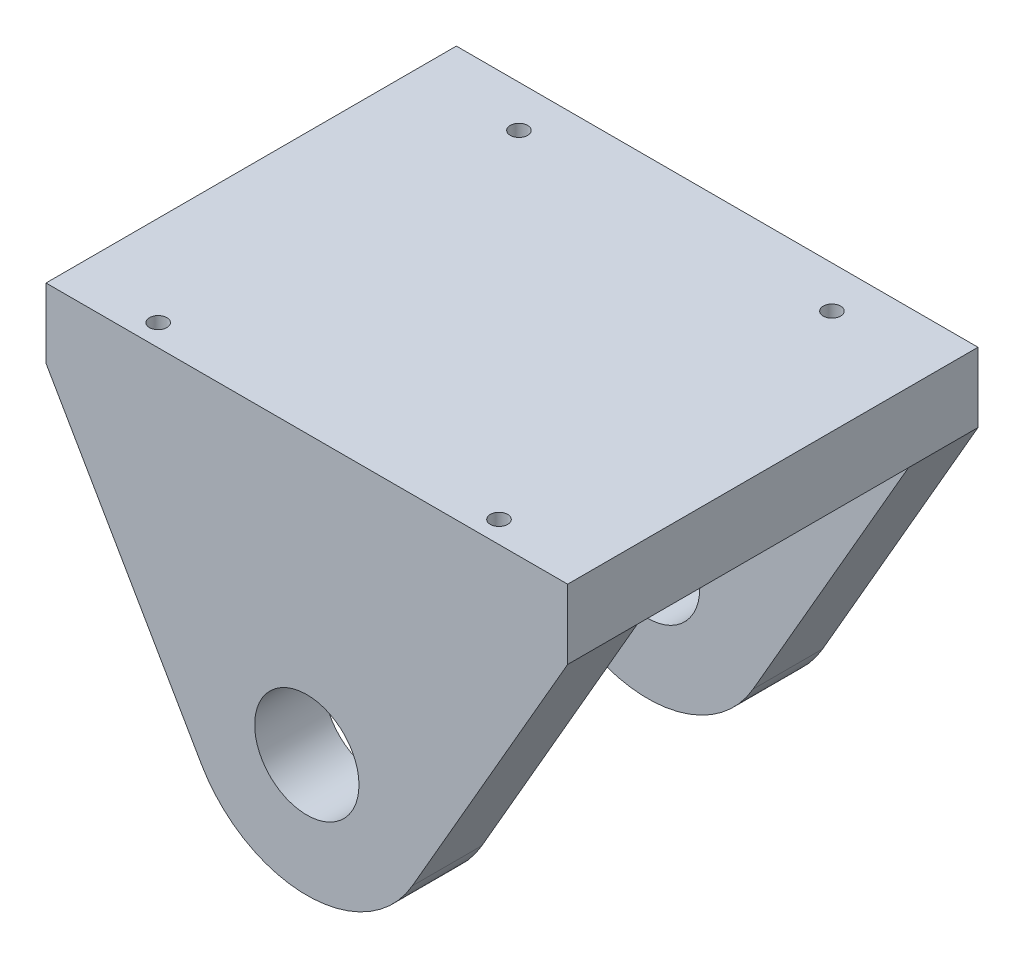
ISO-10303-21;
HEADER;
FILE_DESCRIPTION(('STEP AP214'),'2;1');
FILE_NAME('part.step','',(''),(''),'','','');
FILE_SCHEMA(('AUTOMOTIVE_DESIGN { 1 0 10303 214 1 1 1 1 }'));
ENDSEC;
DATA;
#1=APPLICATION_CONTEXT('core data for automotive mechanical design processes');
#2=APPLICATION_PROTOCOL_DEFINITION('international standard','automotive_design',2000,#1);
#3=PRODUCT_CONTEXT('',#1,'mechanical');
#4=PRODUCT('Part','Part','',(#3));
#5=PRODUCT_RELATED_PRODUCT_CATEGORY('part','',(#4));
#6=PRODUCT_DEFINITION_FORMATION('','',#4);
#7=PRODUCT_DEFINITION_CONTEXT('part definition',#1,'design');
#8=PRODUCT_DEFINITION('design','',#6,#7);
#9=PRODUCT_DEFINITION_SHAPE('','',#8);
#10=(LENGTH_UNIT() NAMED_UNIT(*) SI_UNIT(.MILLI.,.METRE.));
#11=(NAMED_UNIT(*) PLANE_ANGLE_UNIT() SI_UNIT($,.RADIAN.));
#12=(NAMED_UNIT(*) SI_UNIT($,.STERADIAN.) SOLID_ANGLE_UNIT());
#13=UNCERTAINTY_MEASURE_WITH_UNIT(LENGTH_MEASURE(1.E-05),#10,'distance_accuracy_value','');
#14=(GEOMETRIC_REPRESENTATION_CONTEXT(3) GLOBAL_UNCERTAINTY_ASSIGNED_CONTEXT((#13)) GLOBAL_UNIT_ASSIGNED_CONTEXT((#10,
#11,#12)) REPRESENTATION_CONTEXT('',''));
#15=CARTESIAN_POINT('',(0.,0.,0.));
#16=DIRECTION('',(0.,0.,1.));
#17=DIRECTION('',(1.,0.,0.));
#18=AXIS2_PLACEMENT_3D('',#15,#16,#17);
#19=CARTESIAN_POINT('',(0.,30.,-59.));
#20=DIRECTION('',(0.,-1.,0.));
#21=DIRECTION('',(0.,0.,-1.));
#22=AXIS2_PLACEMENT_3D('',#19,#20,#21);
#23=PLANE('',#22);
#24=DIRECTION('',(0.,0.,1.));
#25=VECTOR('',#24,1.);
#26=CARTESIAN_POINT('',(-37.5,30.,-59.));
#27=LINE('',#26,#25);
#28=CARTESIAN_POINT('',(-37.5,30.,-49.));
#29=VERTEX_POINT('',#28);
#30=CARTESIAN_POINT('',(-37.5,30.,-10.));
#31=VERTEX_POINT('',#30);
#32=EDGE_CURVE('E85',#29,#31,#27,.T.);
#33=ORIENTED_EDGE('',*,*,#32,.F.);
#34=DIRECTION('',(1.,0.,0.));
#35=VECTOR('',#34,1.);
#36=CARTESIAN_POINT('',(0.,30.,-49.));
#37=LINE('',#36,#35);
#38=CARTESIAN_POINT('',(37.5,30.,-49.));
#39=VERTEX_POINT('',#38);
#40=EDGE_CURVE('E80',#29,#39,#37,.T.);
#41=ORIENTED_EDGE('',*,*,#40,.T.);
#42=DIRECTION('',(0.,0.,1.));
#43=VECTOR('',#42,1.);
#44=CARTESIAN_POINT('',(37.5,30.,-59.));
#45=LINE('',#44,#43);
#46=CARTESIAN_POINT('',(37.5,30.,-10.));
#47=VERTEX_POINT('',#46);
#48=EDGE_CURVE('E256',#39,#47,#45,.T.);
#49=ORIENTED_EDGE('',*,*,#48,.T.);
#50=DIRECTION('',(1.,0.,0.));
#51=VECTOR('',#50,1.);
#52=CARTESIAN_POINT('',(0.,30.,-10.));
#53=LINE('',#52,#51);
#54=EDGE_CURVE('E280',#31,#47,#53,.T.);
#55=ORIENTED_EDGE('',*,*,#54,.F.);
#56=EDGE_LOOP('',(#33,#41,#49,#55));
#57=FACE_BOUND('',#56,.T.);
#58=ADVANCED_FACE('F62',(#57),#23,.T.);
#59=CARTESIAN_POINT('',(-15.1601468894299,-8.74185027845409,-10.));
#60=DIRECTION('',(0.866294107967425,0.499534301625948,0.));
#61=DIRECTION('',(-0.499534301625948,0.866294107967425,0.));
#62=AXIS2_PLACEMENT_3D('',#59,#60,#61);
#63=PLANE('',#62);
#64=DIRECTION('',(-0.499534301625948,0.866294107967425,0.));
#65=VECTOR('',#64,1.);
#66=CARTESIAN_POINT('',(-15.1601468894299,-8.74185027845409,0.));
#67=LINE('',#66,#65);
#68=CARTESIAN_POINT('',(-15.1601468894299,-8.74185027845409,0.));
#69=VERTEX_POINT('',#68);
#70=CARTESIAN_POINT('',(-37.5,30.,0.));
#71=VERTEX_POINT('',#70);
#72=EDGE_CURVE('E255',#69,#71,#67,.T.);
#73=ORIENTED_EDGE('',*,*,#72,.T.);
#74=DIRECTION('',(0.,0.,1.));
#75=VECTOR('',#74,1.);
#76=CARTESIAN_POINT('',(-37.5,30.,-10.));
#77=LINE('',#76,#75);
#78=EDGE_CURVE('E13',#31,#71,#77,.T.);
#79=ORIENTED_EDGE('',*,*,#78,.F.);
#80=DIRECTION('',(-0.499534301625948,0.866294107967425,0.));
#81=VECTOR('',#80,1.);
#82=CARTESIAN_POINT('',(-15.1601468894299,-8.74185027845409,-10.));
#83=LINE('',#82,#81);
#84=CARTESIAN_POINT('',(-15.1601468894299,-8.74185027845409,-10.));
#85=VERTEX_POINT('',#84);
#86=EDGE_CURVE('E267',#85,#31,#83,.T.);
#87=ORIENTED_EDGE('',*,*,#86,.F.);
#88=DIRECTION('',(0.,0.,1.));
#89=VECTOR('',#88,1.);
#90=CARTESIAN_POINT('',(-15.1601468894299,-8.74185027845409,-10.));
#91=LINE('',#90,#89);
#92=EDGE_CURVE('E66',#85,#69,#91,.T.);
#93=ORIENTED_EDGE('',*,*,#92,.T.);
#94=EDGE_LOOP('',(#73,#79,#87,#93));
#95=FACE_BOUND('',#94,.T.);
#96=ADVANCED_FACE('F64',(#95),#63,.F.);
#97=CARTESIAN_POINT('',(15.1601468894299,-8.74185027845409,-10.));
#98=DIRECTION('',(0.866294107967425,-0.499534301625948,0.));
#99=DIRECTION('',(0.499534301625948,0.866294107967425,0.));
#100=AXIS2_PLACEMENT_3D('',#97,#98,#99);
#101=PLANE('',#100);
#102=DIRECTION('',(0.499534301625948,0.866294107967425,0.));
#103=VECTOR('',#102,1.);
#104=CARTESIAN_POINT('',(15.1601468894299,-8.74185027845409,0.));
#105=LINE('',#104,#103);
#106=CARTESIAN_POINT('',(15.1601468894299,-8.74185027845409,0.));
#107=VERTEX_POINT('',#106);
#108=CARTESIAN_POINT('',(37.5,30.,0.));
#109=VERTEX_POINT('',#108);
#110=EDGE_CURVE('E295',#107,#109,#105,.T.);
#111=ORIENTED_EDGE('',*,*,#110,.F.);
#112=DIRECTION('',(0.,0.,1.));
#113=VECTOR('',#112,1.);
#114=CARTESIAN_POINT('',(15.1601468894299,-8.74185027845409,-10.));
#115=LINE('',#114,#113);
#116=CARTESIAN_POINT('',(15.1601468894299,-8.74185027845409,-10.));
#117=VERTEX_POINT('',#116);
#118=EDGE_CURVE('E304',#117,#107,#115,.T.);
#119=ORIENTED_EDGE('',*,*,#118,.F.);
#120=DIRECTION('',(0.499534301625948,0.866294107967425,0.));
#121=VECTOR('',#120,1.);
#122=CARTESIAN_POINT('',(15.1601468894299,-8.74185027845409,-10.));
#123=LINE('',#122,#121);
#124=EDGE_CURVE('E276',#117,#47,#123,.T.);
#125=ORIENTED_EDGE('',*,*,#124,.T.);
#126=DIRECTION('',(0.,0.,1.));
#127=VECTOR('',#126,1.);
#128=CARTESIAN_POINT('',(37.5,30.,-10.));
#129=LINE('',#128,#127);
#130=EDGE_CURVE('E72',#47,#109,#129,.T.);
#131=ORIENTED_EDGE('',*,*,#130,.T.);
#132=EDGE_LOOP('',(#111,#119,#125,#131));
#133=FACE_BOUND('',#132,.T.);
#134=ADVANCED_FACE('F325',(#133),#101,.T.);
#135=CARTESIAN_POINT('',(0.,0.,-10.));
#136=DIRECTION('',(0.,0.,1.));
#137=DIRECTION('',(1.,0.,0.));
#138=AXIS2_PLACEMENT_3D('',#135,#136,#137);
#139=CYLINDRICAL_SURFACE('',#138,17.5);
#140=CARTESIAN_POINT('',(0.,0.,0.));
#141=DIRECTION('',(0.,0.,1.));
#142=DIRECTION('',(1.,0.,0.));
#143=AXIS2_PLACEMENT_3D('',#140,#141,#142);
#144=CIRCLE('',#143,17.5);
#145=EDGE_CURVE('E291',#69,#107,#144,.T.);
#146=ORIENTED_EDGE('',*,*,#145,.F.);
#147=ORIENTED_EDGE('',*,*,#92,.F.);
#148=CARTESIAN_POINT('',(0.,0.,-10.));
#149=DIRECTION('',(0.,0.,1.));
#150=DIRECTION('',(1.,0.,0.));
#151=AXIS2_PLACEMENT_3D('',#148,#149,#150);
#152=CIRCLE('',#151,17.5);
#153=EDGE_CURVE('E271',#85,#117,#152,.T.);
#154=ORIENTED_EDGE('',*,*,#153,.T.);
#155=ORIENTED_EDGE('',*,*,#118,.T.);
#156=EDGE_LOOP('',(#146,#147,#154,#155));
#157=FACE_BOUND('',#156,.T.);
#158=ADVANCED_FACE('F322',(#157),#139,.T.);
#159=CARTESIAN_POINT('',(0.,0.,-10.));
#160=DIRECTION('',(0.,0.,1.));
#161=DIRECTION('',(1.,0.,0.));
#162=AXIS2_PLACEMENT_3D('',#159,#160,#161);
#163=CYLINDRICAL_SURFACE('',#162,7.5);
#164=CARTESIAN_POINT('',(0.,0.,-10.));
#165=DIRECTION('',(0.,0.,1.));
#166=DIRECTION('',(1.,0.,0.));
#167=AXIS2_PLACEMENT_3D('',#164,#165,#166);
#168=CIRCLE('',#167,7.5);
#169=CARTESIAN_POINT('',(7.5,0.,-10.));
#170=VERTEX_POINT('',#169);
#171=EDGE_CURVE('E284',#170,#170,#168,.T.);
#172=ORIENTED_EDGE('',*,*,#171,.F.);
#173=EDGE_LOOP('',(#172));
#174=FACE_BOUND('',#173,.T.);
#175=CARTESIAN_POINT('',(0.,0.,0.));
#176=DIRECTION('',(0.,0.,1.));
#177=DIRECTION('',(1.,0.,0.));
#178=AXIS2_PLACEMENT_3D('',#175,#176,#177);
#179=CIRCLE('',#178,7.5);
#180=CARTESIAN_POINT('',(7.5,0.,0.));
#181=VERTEX_POINT('',#180);
#182=EDGE_CURVE('E272',#181,#181,#179,.T.);
#183=ORIENTED_EDGE('',*,*,#182,.T.);
#184=EDGE_LOOP('',(#183));
#185=FACE_BOUND('',#184,.T.);
#186=ADVANCED_FACE('F324',(#174,#185),#163,.F.);
#187=CARTESIAN_POINT('',(0.,0.,-10.));
#188=DIRECTION('',(0.,0.,1.));
#189=DIRECTION('',(1.,0.,0.));
#190=AXIS2_PLACEMENT_3D('',#187,#188,#189);
#191=PLANE('',#190);
#192=ORIENTED_EDGE('',*,*,#86,.T.);
#193=ORIENTED_EDGE('',*,*,#54,.T.);
#194=ORIENTED_EDGE('',*,*,#124,.F.);
#195=ORIENTED_EDGE('',*,*,#153,.F.);
#196=EDGE_LOOP('',(#192,#193,#194,#195));
#197=FACE_BOUND('',#196,.T.);
#198=ORIENTED_EDGE('',*,*,#171,.T.);
#199=EDGE_LOOP('',(#198));
#200=FACE_BOUND('',#199,.T.);
#201=ADVANCED_FACE('F329',(#197,#200),#191,.F.);
#202=CARTESIAN_POINT('',(0.,0.,0.));
#203=DIRECTION('',(0.,0.,1.));
#204=DIRECTION('',(1.,0.,0.));
#205=AXIS2_PLACEMENT_3D('',#202,#203,#204);
#206=PLANE('',#205);
#207=ORIENTED_EDGE('',*,*,#72,.F.);
#208=ORIENTED_EDGE('',*,*,#145,.T.);
#209=ORIENTED_EDGE('',*,*,#110,.T.);
#210=DIRECTION('',(0.,-1.,0.));
#211=VECTOR('',#210,1.);
#212=CARTESIAN_POINT('',(37.5,0.,0.));
#213=LINE('',#212,#211);
#214=CARTESIAN_POINT('',(37.5,40.,0.));
#215=VERTEX_POINT('',#214);
#216=EDGE_CURVE('E228',#215,#109,#213,.T.);
#217=ORIENTED_EDGE('',*,*,#216,.F.);
#218=DIRECTION('',(1.,0.,0.));
#219=VECTOR('',#218,1.);
#220=CARTESIAN_POINT('',(0.,40.,0.));
#221=LINE('',#220,#219);
#222=CARTESIAN_POINT('',(-37.5,40.,0.));
#223=VERTEX_POINT('',#222);
#224=EDGE_CURVE('E246',#223,#215,#221,.T.);
#225=ORIENTED_EDGE('',*,*,#224,.F.);
#226=DIRECTION('',(0.,1.,0.));
#227=VECTOR('',#226,1.);
#228=CARTESIAN_POINT('',(-37.5,0.,0.));
#229=LINE('',#228,#227);
#230=EDGE_CURVE('E237',#71,#223,#229,.T.);
#231=ORIENTED_EDGE('',*,*,#230,.F.);
#232=EDGE_LOOP('',(#207,#208,#209,#217,#225,#231));
#233=FACE_BOUND('',#232,.T.);
#234=ORIENTED_EDGE('',*,*,#182,.F.);
#235=EDGE_LOOP('',(#234));
#236=FACE_BOUND('',#235,.T.);
#237=ADVANCED_FACE('F319',(#233,#236),#206,.T.);
#238=CARTESIAN_POINT('',(37.5,0.,-59.));
#239=DIRECTION('',(-1.,0.,0.));
#240=DIRECTION('',(0.,-1.,0.));
#241=AXIS2_PLACEMENT_3D('',#238,#239,#240);
#242=PLANE('',#241);
#243=ORIENTED_EDGE('',*,*,#216,.T.);
#244=ORIENTED_EDGE('',*,*,#130,.F.);
#245=ORIENTED_EDGE('',*,*,#48,.F.);
#246=CARTESIAN_POINT('',(37.5,30.,-59.));
#247=VERTEX_POINT('',#246);
#248=EDGE_CURVE('E251',#247,#39,#45,.T.);
#249=ORIENTED_EDGE('',*,*,#248,.F.);
#250=DIRECTION('',(0.,-1.,0.));
#251=VECTOR('',#250,1.);
#252=CARTESIAN_POINT('',(37.5,0.,-59.));
#253=LINE('',#252,#251);
#254=CARTESIAN_POINT('',(37.5,40.,-59.));
#255=VERTEX_POINT('',#254);
#256=EDGE_CURVE('E232',#255,#247,#253,.T.);
#257=ORIENTED_EDGE('',*,*,#256,.F.);
#258=DIRECTION('',(0.,0.,1.));
#259=VECTOR('',#258,1.);
#260=CARTESIAN_POINT('',(37.5,40.,-59.));
#261=LINE('',#260,#259);
#262=EDGE_CURVE('E243',#255,#215,#261,.T.);
#263=ORIENTED_EDGE('',*,*,#262,.T.);
#264=EDGE_LOOP('',(#243,#244,#245,#249,#257,#263));
#265=FACE_BOUND('',#264,.T.);
#266=ADVANCED_FACE('F350',(#265),#242,.F.);
#267=CARTESIAN_POINT('',(-37.5,0.,-59.));
#268=DIRECTION('',(1.,0.,0.));
#269=DIRECTION('',(0.,0.,-1.));
#270=AXIS2_PLACEMENT_3D('',#267,#268,#269);
#271=PLANE('',#270);
#272=ORIENTED_EDGE('',*,*,#230,.T.);
#273=DIRECTION('',(0.,0.,1.));
#274=VECTOR('',#273,1.);
#275=CARTESIAN_POINT('',(-37.5,40.,-59.));
#276=LINE('',#275,#274);
#277=CARTESIAN_POINT('',(-37.5,40.,-59.));
#278=VERTEX_POINT('',#277);
#279=EDGE_CURVE('E260',#278,#223,#276,.T.);
#280=ORIENTED_EDGE('',*,*,#279,.F.);
#281=DIRECTION('',(0.,1.,0.));
#282=VECTOR('',#281,1.);
#283=CARTESIAN_POINT('',(-37.5,0.,-59.));
#284=LINE('',#283,#282);
#285=CARTESIAN_POINT('',(-37.5,30.,-59.));
#286=VERTEX_POINT('',#285);
#287=EDGE_CURVE('E240',#286,#278,#284,.T.);
#288=ORIENTED_EDGE('',*,*,#287,.F.);
#289=EDGE_CURVE('E257',#286,#29,#27,.T.);
#290=ORIENTED_EDGE('',*,*,#289,.T.);
#291=ORIENTED_EDGE('',*,*,#32,.T.);
#292=ORIENTED_EDGE('',*,*,#78,.T.);
#293=EDGE_LOOP('',(#272,#280,#288,#290,#291,#292));
#294=FACE_BOUND('',#293,.T.);
#295=ADVANCED_FACE('F346',(#294),#271,.F.);
#296=CARTESIAN_POINT('',(0.,40.,-59.));
#297=DIRECTION('',(0.,-1.,0.));
#298=DIRECTION('',(0.,0.,-1.));
#299=AXIS2_PLACEMENT_3D('',#296,#297,#298);
#300=PLANE('',#299);
#301=CARTESIAN_POINT('',(-22.5,40.,-53.));
#302=DIRECTION('',(0.,1.,0.));
#303=DIRECTION('',(0.,0.,1.));
#304=AXIS2_PLACEMENT_3D('',#301,#302,#303);
#305=CIRCLE('',#304,1.24999999999999);
#306=CARTESIAN_POINT('',(-22.5,40.,-51.75));
#307=VERTEX_POINT('',#306);
#308=EDGE_CURVE('E162',#307,#307,#305,.T.);
#309=ORIENTED_EDGE('',*,*,#308,.F.);
#310=EDGE_LOOP('',(#309));
#311=FACE_BOUND('',#310,.T.);
#312=CARTESIAN_POINT('',(22.5,40.,-53.));
#313=DIRECTION('',(0.,1.,0.));
#314=DIRECTION('',(0.,0.,1.));
#315=AXIS2_PLACEMENT_3D('',#312,#313,#314);
#316=CIRCLE('',#315,1.24999999999999);
#317=CARTESIAN_POINT('',(22.5,40.,-51.75));
#318=VERTEX_POINT('',#317);
#319=EDGE_CURVE('E161',#318,#318,#316,.T.);
#320=ORIENTED_EDGE('',*,*,#319,.F.);
#321=EDGE_LOOP('',(#320));
#322=FACE_BOUND('',#321,.T.);
#323=CARTESIAN_POINT('',(-24.5,40.,-3.13));
#324=DIRECTION('',(0.,1.,0.));
#325=DIRECTION('',(0.,0.,1.));
#326=AXIS2_PLACEMENT_3D('',#323,#324,#325);
#327=CIRCLE('',#326,1.24999999999999);
#328=CARTESIAN_POINT('',(-24.5,40.,-1.88000000000001));
#329=VERTEX_POINT('',#328);
#330=EDGE_CURVE('E176',#329,#329,#327,.T.);
#331=ORIENTED_EDGE('',*,*,#330,.F.);
#332=EDGE_LOOP('',(#331));
#333=FACE_BOUND('',#332,.T.);
#334=CARTESIAN_POINT('',(24.5,40.,-3.13));
#335=DIRECTION('',(0.,1.,0.));
#336=DIRECTION('',(0.,0.,1.));
#337=AXIS2_PLACEMENT_3D('',#334,#335,#336);
#338=CIRCLE('',#337,1.24999999999999);
#339=CARTESIAN_POINT('',(24.5,40.,-1.88000000000001));
#340=VERTEX_POINT('',#339);
#341=EDGE_CURVE('E184',#340,#340,#338,.T.);
#342=ORIENTED_EDGE('',*,*,#341,.F.);
#343=EDGE_LOOP('',(#342));
#344=FACE_BOUND('',#343,.T.);
#345=ORIENTED_EDGE('',*,*,#224,.T.);
#346=ORIENTED_EDGE('',*,*,#262,.F.);
#347=DIRECTION('',(1.,0.,0.));
#348=VECTOR('',#347,1.);
#349=CARTESIAN_POINT('',(0.,40.,-59.));
#350=LINE('',#349,#348);
#351=EDGE_CURVE('E236',#278,#255,#350,.T.);
#352=ORIENTED_EDGE('',*,*,#351,.F.);
#353=ORIENTED_EDGE('',*,*,#279,.T.);
#354=EDGE_LOOP('',(#345,#346,#352,#353));
#355=FACE_BOUND('',#354,.T.);
#356=ADVANCED_FACE('F349',(#311,#322,#333,#344,#355),#300,.F.);
#357=CARTESIAN_POINT('',(0.,0.,-59.));
#358=DIRECTION('',(0.,0.,1.));
#359=DIRECTION('',(1.,0.,0.));
#360=AXIS2_PLACEMENT_3D('',#357,#358,#359);
#361=PLANE('',#360);
#362=ORIENTED_EDGE('',*,*,#256,.T.);
#363=DIRECTION('',(0.499534301625948,0.866294107967425,0.));
#364=VECTOR('',#363,1.);
#365=CARTESIAN_POINT('',(15.1601468894299,-8.74185027845409,-59.));
#366=LINE('',#365,#364);
#367=CARTESIAN_POINT('',(15.1601468894299,-8.74185027845409,-59.));
#368=VERTEX_POINT('',#367);
#369=EDGE_CURVE('E215',#368,#247,#366,.T.);
#370=ORIENTED_EDGE('',*,*,#369,.F.);
#371=CARTESIAN_POINT('',(0.,0.,-59.));
#372=DIRECTION('',(0.,0.,1.));
#373=DIRECTION('',(1.,0.,0.));
#374=AXIS2_PLACEMENT_3D('',#371,#372,#373);
#375=CIRCLE('',#374,17.5);
#376=CARTESIAN_POINT('',(-15.1601468894299,-8.74185027845409,-59.));
#377=VERTEX_POINT('',#376);
#378=EDGE_CURVE('E219',#377,#368,#375,.T.);
#379=ORIENTED_EDGE('',*,*,#378,.F.);
#380=DIRECTION('',(-0.499534301625948,0.866294107967425,0.));
#381=VECTOR('',#380,1.);
#382=CARTESIAN_POINT('',(-15.1601468894299,-8.74185027845409,-59.));
#383=LINE('',#382,#381);
#384=EDGE_CURVE('E192',#377,#286,#383,.T.);
#385=ORIENTED_EDGE('',*,*,#384,.T.);
#386=ORIENTED_EDGE('',*,*,#287,.T.);
#387=ORIENTED_EDGE('',*,*,#351,.T.);
#388=EDGE_LOOP('',(#362,#370,#379,#385,#386,#387));
#389=FACE_BOUND('',#388,.T.);
#390=CARTESIAN_POINT('',(0.,0.,-59.));
#391=DIRECTION('',(0.,0.,1.));
#392=DIRECTION('',(1.,0.,0.));
#393=AXIS2_PLACEMENT_3D('',#390,#391,#392);
#394=CIRCLE('',#393,7.5);
#395=CARTESIAN_POINT('',(7.5,0.,-59.));
#396=VERTEX_POINT('',#395);
#397=EDGE_CURVE('E197',#396,#396,#394,.T.);
#398=ORIENTED_EDGE('',*,*,#397,.T.);
#399=EDGE_LOOP('',(#398));
#400=FACE_BOUND('',#399,.T.);
#401=ADVANCED_FACE('F344',(#389,#400),#361,.F.);
#402=CARTESIAN_POINT('',(-15.1601468894299,-8.74185027845409,-49.));
#403=DIRECTION('',(-0.866294107967425,-0.499534301625948,0.));
#404=DIRECTION('',(0.499534301625948,-0.866294107967425,0.));
#405=AXIS2_PLACEMENT_3D('',#402,#403,#404);
#406=PLANE('',#405);
#407=ORIENTED_EDGE('',*,*,#384,.F.);
#408=DIRECTION('',(0.,0.,-1.));
#409=VECTOR('',#408,1.);
#410=CARTESIAN_POINT('',(-15.1601468894299,-8.74185027845409,-49.));
#411=LINE('',#410,#409);
#412=CARTESIAN_POINT('',(-15.1601468894299,-8.74185027845409,-49.));
#413=VERTEX_POINT('',#412);
#414=EDGE_CURVE('E225',#413,#377,#411,.T.);
#415=ORIENTED_EDGE('',*,*,#414,.F.);
#416=DIRECTION('',(-0.499534301625948,0.866294107967425,0.));
#417=VECTOR('',#416,1.);
#418=CARTESIAN_POINT('',(-15.1601468894299,-8.74185027845409,-49.));
#419=LINE('',#418,#417);
#420=EDGE_CURVE('E193',#413,#29,#419,.T.);
#421=ORIENTED_EDGE('',*,*,#420,.T.);
#422=ORIENTED_EDGE('',*,*,#289,.F.);
#423=EDGE_LOOP('',(#407,#415,#421,#422));
#424=FACE_BOUND('',#423,.T.);
#425=ADVANCED_FACE('F417',(#424),#406,.T.);
#426=CARTESIAN_POINT('',(0.,0.,-49.));
#427=DIRECTION('',(0.,0.,-1.));
#428=DIRECTION('',(-1.,0.,0.));
#429=AXIS2_PLACEMENT_3D('',#426,#427,#428);
#430=CYLINDRICAL_SURFACE('',#429,17.5);
#431=ORIENTED_EDGE('',*,*,#378,.T.);
#432=DIRECTION('',(0.,0.,-1.));
#433=VECTOR('',#432,1.);
#434=CARTESIAN_POINT('',(15.1601468894299,-8.74185027845409,-49.));
#435=LINE('',#434,#433);
#436=CARTESIAN_POINT('',(15.1601468894299,-8.74185027845409,-49.));
#437=VERTEX_POINT('',#436);
#438=EDGE_CURVE('E211',#437,#368,#435,.T.);
#439=ORIENTED_EDGE('',*,*,#438,.F.);
#440=CARTESIAN_POINT('',(0.,0.,-49.));
#441=DIRECTION('',(0.,0.,1.));
#442=DIRECTION('',(1.,0.,0.));
#443=AXIS2_PLACEMENT_3D('',#440,#441,#442);
#444=CIRCLE('',#443,17.5);
#445=EDGE_CURVE('E204',#413,#437,#444,.T.);
#446=ORIENTED_EDGE('',*,*,#445,.F.);
#447=ORIENTED_EDGE('',*,*,#414,.T.);
#448=EDGE_LOOP('',(#431,#439,#446,#447));
#449=FACE_BOUND('',#448,.T.);
#450=ADVANCED_FACE('F431',(#449),#430,.T.);
#451=CARTESIAN_POINT('',(15.1601468894299,-8.74185027845409,-49.));
#452=DIRECTION('',(-0.866294107967425,0.499534301625948,0.));
#453=DIRECTION('',(-0.499534301625948,-0.866294107967425,0.));
#454=AXIS2_PLACEMENT_3D('',#451,#452,#453);
#455=PLANE('',#454);
#456=ORIENTED_EDGE('',*,*,#369,.T.);
#457=ORIENTED_EDGE('',*,*,#248,.T.);
#458=DIRECTION('',(0.499534301625948,0.866294107967425,0.));
#459=VECTOR('',#458,1.);
#460=CARTESIAN_POINT('',(15.1601468894299,-8.74185027845409,-49.));
#461=LINE('',#460,#459);
#462=EDGE_CURVE('E200',#437,#39,#461,.T.);
#463=ORIENTED_EDGE('',*,*,#462,.F.);
#464=ORIENTED_EDGE('',*,*,#438,.T.);
#465=EDGE_LOOP('',(#456,#457,#463,#464));
#466=FACE_BOUND('',#465,.T.);
#467=ADVANCED_FACE('F440',(#466),#455,.F.);
#468=CARTESIAN_POINT('',(0.,0.,-49.));
#469=DIRECTION('',(0.,0.,-1.));
#470=DIRECTION('',(-1.,0.,0.));
#471=AXIS2_PLACEMENT_3D('',#468,#469,#470);
#472=CYLINDRICAL_SURFACE('',#471,7.5);
#473=CARTESIAN_POINT('',(0.,0.,-49.));
#474=DIRECTION('',(0.,0.,1.));
#475=DIRECTION('',(1.,0.,0.));
#476=AXIS2_PLACEMENT_3D('',#473,#474,#475);
#477=CIRCLE('',#476,7.5);
#478=CARTESIAN_POINT('',(7.5,0.,-49.));
#479=VERTEX_POINT('',#478);
#480=EDGE_CURVE('E207',#479,#479,#477,.T.);
#481=ORIENTED_EDGE('',*,*,#480,.T.);
#482=EDGE_LOOP('',(#481));
#483=FACE_BOUND('',#482,.T.);
#484=ORIENTED_EDGE('',*,*,#397,.F.);
#485=EDGE_LOOP('',(#484));
#486=FACE_BOUND('',#485,.T.);
#487=ADVANCED_FACE('F449',(#483,#486),#472,.F.);
#488=CARTESIAN_POINT('',(0.,0.,-49.));
#489=DIRECTION('',(0.,0.,-1.));
#490=DIRECTION('',(1.,0.,0.));
#491=AXIS2_PLACEMENT_3D('',#488,#489,#490);
#492=PLANE('',#491);
#493=ORIENTED_EDGE('',*,*,#420,.F.);
#494=ORIENTED_EDGE('',*,*,#445,.T.);
#495=ORIENTED_EDGE('',*,*,#462,.T.);
#496=ORIENTED_EDGE('',*,*,#40,.F.);
#497=EDGE_LOOP('',(#493,#494,#495,#496));
#498=FACE_BOUND('',#497,.T.);
#499=ORIENTED_EDGE('',*,*,#480,.F.);
#500=EDGE_LOOP('',(#499));
#501=FACE_BOUND('',#500,.T.);
#502=ADVANCED_FACE('F458',(#498,#501),#492,.F.);
#503=CARTESIAN_POINT('',(24.5,32.,-3.13));
#504=DIRECTION('',(0.,1.,0.));
#505=DIRECTION('',(0.,0.,1.));
#506=AXIS2_PLACEMENT_3D('',#503,#504,#505);
#507=CONICAL_SURFACE('',#506,1.25,1.02974425867665);
#508=CARTESIAN_POINT('',(24.5,31.2489242262155,-3.13));
#509=VERTEX_POINT('',#508);
#510=VERTEX_LOOP('',#509);
#511=FACE_BOUND('',#510,.T.);
#512=CARTESIAN_POINT('',(24.5,32.,-3.13));
#513=DIRECTION('',(0.,1.,0.));
#514=DIRECTION('',(0.,0.,1.));
#515=AXIS2_PLACEMENT_3D('',#512,#513,#514);
#516=CIRCLE('',#515,1.25);
#517=CARTESIAN_POINT('',(24.5,32.,-1.88));
#518=VERTEX_POINT('',#517);
#519=EDGE_CURVE('E188',#518,#518,#516,.T.);
#520=ORIENTED_EDGE('',*,*,#519,.T.);
#521=EDGE_LOOP('',(#520));
#522=FACE_BOUND('',#521,.T.);
#523=ADVANCED_FACE('F467',(#511,#522),#507,.F.);
#524=CARTESIAN_POINT('',(24.5,40.,-3.13));
#525=DIRECTION('',(0.,1.,0.));
#526=DIRECTION('',(0.,0.,1.));
#527=AXIS2_PLACEMENT_3D('',#524,#525,#526);
#528=CYLINDRICAL_SURFACE('',#527,1.24999999999999);
#529=ORIENTED_EDGE('',*,*,#519,.F.);
#530=EDGE_LOOP('',(#529));
#531=FACE_BOUND('',#530,.T.);
#532=ORIENTED_EDGE('',*,*,#341,.T.);
#533=EDGE_LOOP('',(#532));
#534=FACE_BOUND('',#533,.T.);
#535=ADVANCED_FACE('F477',(#531,#534),#528,.F.);
#536=CARTESIAN_POINT('',(-24.5,32.,-3.13));
#537=DIRECTION('',(0.,1.,0.));
#538=DIRECTION('',(0.,0.,1.));
#539=AXIS2_PLACEMENT_3D('',#536,#537,#538);
#540=CONICAL_SURFACE('',#539,1.25,1.02974425867665);
#541=CARTESIAN_POINT('',(-24.5,31.2489242262155,-3.13));
#542=VERTEX_POINT('',#541);
#543=VERTEX_LOOP('',#542);
#544=FACE_BOUND('',#543,.T.);
#545=CARTESIAN_POINT('',(-24.5,32.,-3.13));
#546=DIRECTION('',(0.,1.,0.));
#547=DIRECTION('',(0.,0.,1.));
#548=AXIS2_PLACEMENT_3D('',#545,#546,#547);
#549=CIRCLE('',#548,1.25);
#550=CARTESIAN_POINT('',(-24.5,32.,-1.88));
#551=VERTEX_POINT('',#550);
#552=EDGE_CURVE('E180',#551,#551,#549,.T.);
#553=ORIENTED_EDGE('',*,*,#552,.T.);
#554=EDGE_LOOP('',(#553));
#555=FACE_BOUND('',#554,.T.);
#556=ADVANCED_FACE('F486',(#544,#555),#540,.F.);
#557=CARTESIAN_POINT('',(-24.5,40.,-3.13));
#558=DIRECTION('',(0.,1.,0.));
#559=DIRECTION('',(0.,0.,1.));
#560=AXIS2_PLACEMENT_3D('',#557,#558,#559);
#561=CYLINDRICAL_SURFACE('',#560,1.24999999999999);
#562=ORIENTED_EDGE('',*,*,#552,.F.);
#563=EDGE_LOOP('',(#562));
#564=FACE_BOUND('',#563,.T.);
#565=ORIENTED_EDGE('',*,*,#330,.T.);
#566=EDGE_LOOP('',(#565));
#567=FACE_BOUND('',#566,.T.);
#568=ADVANCED_FACE('F495',(#564,#567),#561,.F.);
#569=CARTESIAN_POINT('',(22.5,32.,-53.));
#570=DIRECTION('',(0.,1.,0.));
#571=DIRECTION('',(0.,0.,1.));
#572=AXIS2_PLACEMENT_3D('',#569,#570,#571);
#573=CONICAL_SURFACE('',#572,1.25,1.02974425867665);
#574=CARTESIAN_POINT('',(22.5,31.2489242262155,-53.));
#575=VERTEX_POINT('',#574);
#576=VERTEX_LOOP('',#575);
#577=FACE_BOUND('',#576,.T.);
#578=CARTESIAN_POINT('',(22.5,32.,-53.));
#579=DIRECTION('',(0.,1.,0.));
#580=DIRECTION('',(0.,0.,1.));
#581=AXIS2_PLACEMENT_3D('',#578,#579,#580);
#582=CIRCLE('',#581,1.25);
#583=CARTESIAN_POINT('',(22.5,32.,-51.75));
#584=VERTEX_POINT('',#583);
#585=EDGE_CURVE('E168',#584,#584,#582,.T.);
#586=ORIENTED_EDGE('',*,*,#585,.T.);
#587=EDGE_LOOP('',(#586));
#588=FACE_BOUND('',#587,.T.);
#589=ADVANCED_FACE('F504',(#577,#588),#573,.F.);
#590=CARTESIAN_POINT('',(22.5,40.,-53.));
#591=DIRECTION('',(0.,1.,0.));
#592=DIRECTION('',(0.,0.,1.));
#593=AXIS2_PLACEMENT_3D('',#590,#591,#592);
#594=CYLINDRICAL_SURFACE('',#593,1.24999999999999);
#595=ORIENTED_EDGE('',*,*,#585,.F.);
#596=EDGE_LOOP('',(#595));
#597=FACE_BOUND('',#596,.T.);
#598=ORIENTED_EDGE('',*,*,#319,.T.);
#599=EDGE_LOOP('',(#598));
#600=FACE_BOUND('',#599,.T.);
#601=ADVANCED_FACE('F154',(#597,#600),#594,.F.);
#602=CARTESIAN_POINT('',(-22.5,32.,-53.));
#603=DIRECTION('',(0.,1.,0.));
#604=DIRECTION('',(0.,0.,1.));
#605=AXIS2_PLACEMENT_3D('',#602,#603,#604);
#606=CONICAL_SURFACE('',#605,1.25,1.02974425867665);
#607=CARTESIAN_POINT('',(-22.5,31.2489242262155,-53.));
#608=VERTEX_POINT('',#607);
#609=VERTEX_LOOP('',#608);
#610=FACE_BOUND('',#609,.T.);
#611=CARTESIAN_POINT('',(-22.5,32.,-53.));
#612=DIRECTION('',(0.,1.,0.));
#613=DIRECTION('',(0.,0.,1.));
#614=AXIS2_PLACEMENT_3D('',#611,#612,#613);
#615=CIRCLE('',#614,1.25);
#616=CARTESIAN_POINT('',(-22.5,32.,-51.75));
#617=VERTEX_POINT('',#616);
#618=EDGE_CURVE('E158',#617,#617,#615,.T.);
#619=ORIENTED_EDGE('',*,*,#618,.T.);
#620=EDGE_LOOP('',(#619));
#621=FACE_BOUND('',#620,.T.);
#622=ADVANCED_FACE('F150',(#610,#621),#606,.F.);
#623=CARTESIAN_POINT('',(-22.5,40.,-53.));
#624=DIRECTION('',(0.,1.,0.));
#625=DIRECTION('',(0.,0.,1.));
#626=AXIS2_PLACEMENT_3D('',#623,#624,#625);
#627=CYLINDRICAL_SURFACE('',#626,1.24999999999999);
#628=ORIENTED_EDGE('',*,*,#618,.F.);
#629=EDGE_LOOP('',(#628));
#630=FACE_BOUND('',#629,.T.);
#631=ORIENTED_EDGE('',*,*,#308,.T.);
#632=EDGE_LOOP('',(#631));
#633=FACE_BOUND('',#632,.T.);
#634=ADVANCED_FACE('F153',(#630,#633),#627,.F.);
#635=CLOSED_SHELL('',(#58,#96,#134,#158,#186,#201,#237,#266,#295,#356,#401,#425,#450,#467,#487,
#502,#523,#535,#556,#568,#589,#601,#622,#634));
#636=MANIFOLD_SOLID_BREP('B2',#635);
#637=ADVANCED_BREP_SHAPE_REPRESENTATION('',(#18,#636),#14);
#638=SHAPE_DEFINITION_REPRESENTATION(#9,#637);
ENDSEC;
END-ISO-10303-21;
